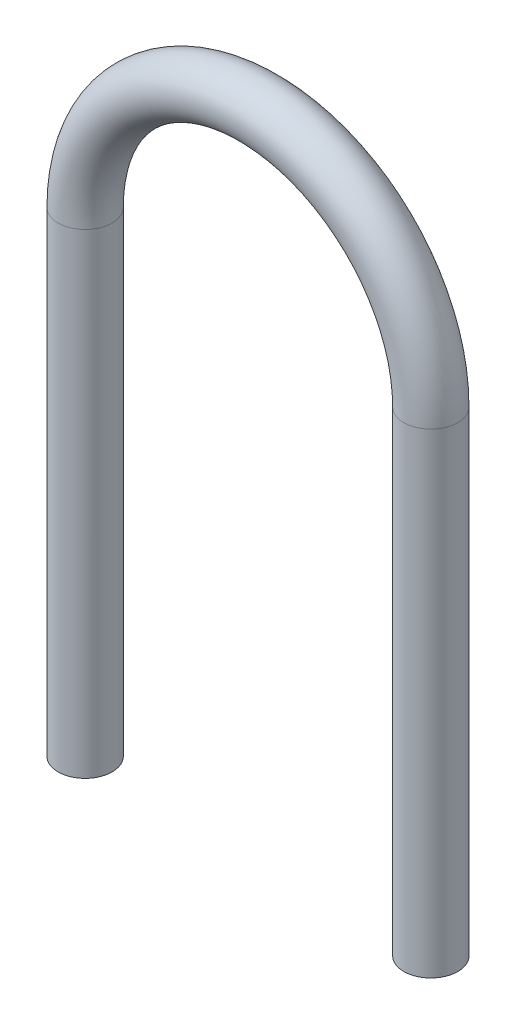
ISO-10303-21;
HEADER;
FILE_DESCRIPTION(('STEP AP214'),'2;1');
FILE_NAME('part.step','',(''),(''),'','','');
FILE_SCHEMA(('AUTOMOTIVE_DESIGN { 1 0 10303 214 1 1 1 1 }'));
ENDSEC;
DATA;
#1=APPLICATION_CONTEXT('core data for automotive mechanical design processes');
#2=APPLICATION_PROTOCOL_DEFINITION('international standard','automotive_design',2000,#1);
#3=PRODUCT_CONTEXT('',#1,'mechanical');
#4=PRODUCT('Part','Part','',(#3));
#5=PRODUCT_RELATED_PRODUCT_CATEGORY('part','',(#4));
#6=PRODUCT_DEFINITION_FORMATION('','',#4);
#7=PRODUCT_DEFINITION_CONTEXT('part definition',#1,'design');
#8=PRODUCT_DEFINITION('design','',#6,#7);
#9=PRODUCT_DEFINITION_SHAPE('','',#8);
#10=(LENGTH_UNIT() NAMED_UNIT(*) SI_UNIT(.MILLI.,.METRE.));
#11=(NAMED_UNIT(*) PLANE_ANGLE_UNIT() SI_UNIT($,.RADIAN.));
#12=(NAMED_UNIT(*) SI_UNIT($,.STERADIAN.) SOLID_ANGLE_UNIT());
#13=UNCERTAINTY_MEASURE_WITH_UNIT(LENGTH_MEASURE(1.E-05),#10,'distance_accuracy_value','');
#14=(GEOMETRIC_REPRESENTATION_CONTEXT(3) GLOBAL_UNCERTAINTY_ASSIGNED_CONTEXT((#13)) GLOBAL_UNIT_ASSIGNED_CONTEXT((#10,
#11,#12)) REPRESENTATION_CONTEXT('',''));
#15=CARTESIAN_POINT('',(0.,0.,0.));
#16=DIRECTION('',(0.,0.,1.));
#17=DIRECTION('',(1.,0.,0.));
#18=AXIS2_PLACEMENT_3D('',#15,#16,#17);
#19=CARTESIAN_POINT('',(-25.4,0.,0.));
#20=DIRECTION('',(0.,-1.,0.));
#21=DIRECTION('',(1.,0.,0.));
#22=AXIS2_PLACEMENT_3D('',#19,#20,#21);
#23=CYLINDRICAL_SURFACE('',#22,3.96875);
#24=CARTESIAN_POINT('',(-25.4,0.,0.));
#25=DIRECTION('',(0.,-1.,0.));
#26=DIRECTION('',(0.,0.,1.));
#27=AXIS2_PLACEMENT_3D('',#24,#25,#26);
#28=CIRCLE('',#27,3.96875);
#29=CARTESIAN_POINT('',(-29.36875,0.,0.));
#30=VERTEX_POINT('',#29);
#31=EDGE_CURVE('E35',#30,#30,#28,.T.);
#32=ORIENTED_EDGE('',*,*,#31,.T.);
#33=EDGE_LOOP('',(#32));
#34=FACE_BOUND('',#33,.T.);
#35=CARTESIAN_POINT('',(-25.4,-69.85,0.));
#36=DIRECTION('',(0.,-1.,0.));
#37=DIRECTION('',(0.,0.,1.));
#38=AXIS2_PLACEMENT_3D('',#35,#36,#37);
#39=CIRCLE('',#38,3.96875);
#40=CARTESIAN_POINT('',(-25.4,-69.85,3.96875));
#41=VERTEX_POINT('',#40);
#42=EDGE_CURVE('E10',#41,#41,#39,.T.);
#43=ORIENTED_EDGE('',*,*,#42,.F.);
#44=EDGE_LOOP('',(#43));
#45=FACE_BOUND('',#44,.T.);
#46=ADVANCED_FACE('F29',(#34,#45),#23,.T.);
#47=CARTESIAN_POINT('',(0.,0.,0.));
#48=DIRECTION('',(0.,0.,1.));
#49=DIRECTION('',(1.,0.,0.));
#50=AXIS2_PLACEMENT_3D('',#47,#48,#49);
#51=TOROIDAL_SURFACE('',#50,25.4,3.96875);
#52=CARTESIAN_POINT('',(25.4,0.,0.));
#53=DIRECTION('',(0.,1.,0.));
#54=DIRECTION('',(0.,0.,1.));
#55=AXIS2_PLACEMENT_3D('',#52,#53,#54);
#56=CIRCLE('',#55,3.96875);
#57=CARTESIAN_POINT('',(29.36875,0.,0.));
#58=VERTEX_POINT('',#57);
#59=EDGE_CURVE('E39',#58,#58,#56,.T.);
#60=CARTESIAN_POINT('',(0.,0.,0.));
#61=DIRECTION('',(0.,0.,1.));
#62=DIRECTION('',(1.,0.,0.));
#63=AXIS2_PLACEMENT_3D('',#60,#61,#62);
#64=CIRCLE('',#63,29.36875);
#65=EDGE_CURVE('',#58,#30,#64,.T.);
#66=ORIENTED_EDGE('',*,*,#59,.T.);
#67=ORIENTED_EDGE('',*,*,#31,.F.);
#68=ORIENTED_EDGE('',*,*,#65,.T.);
#69=ORIENTED_EDGE('',*,*,#65,.F.);
#70=EDGE_LOOP('',(#66,#68,#67,#69));
#71=FACE_BOUND('',#70,.T.);
#72=ADVANCED_FACE('F61',(#71),#51,.T.);
#73=CARTESIAN_POINT('',(25.4,0.,0.));
#74=DIRECTION('',(0.,-1.,0.));
#75=DIRECTION('',(1.,0.,0.));
#76=AXIS2_PLACEMENT_3D('',#73,#74,#75);
#77=CYLINDRICAL_SURFACE('',#76,3.96875);
#78=ORIENTED_EDGE('',*,*,#59,.F.);
#79=EDGE_LOOP('',(#78));
#80=FACE_BOUND('',#79,.T.);
#81=CARTESIAN_POINT('',(25.4,-69.85,0.));
#82=DIRECTION('',(0.,1.,0.));
#83=DIRECTION('',(0.,0.,1.));
#84=AXIS2_PLACEMENT_3D('',#81,#82,#83);
#85=CIRCLE('',#84,3.96875);
#86=CARTESIAN_POINT('',(25.4,-69.85,3.96875));
#87=VERTEX_POINT('',#86);
#88=EDGE_CURVE('E43',#87,#87,#85,.T.);
#89=ORIENTED_EDGE('',*,*,#88,.T.);
#90=EDGE_LOOP('',(#89));
#91=FACE_BOUND('',#90,.T.);
#92=ADVANCED_FACE('F49',(#80,#91),#77,.T.);
#93=CARTESIAN_POINT('',(-25.4,-69.85,0.));
#94=DIRECTION('',(0.,-1.,0.));
#95=DIRECTION('',(0.,0.,1.));
#96=AXIS2_PLACEMENT_3D('',#93,#94,#95);
#97=PLANE('',#96);
#98=ORIENTED_EDGE('',*,*,#42,.T.);
#99=EDGE_LOOP('',(#98));
#100=FACE_BOUND('',#99,.T.);
#101=ADVANCED_FACE('F53',(#100),#97,.T.);
#102=CARTESIAN_POINT('',(25.4,-69.85,0.));
#103=DIRECTION('',(0.,1.,0.));
#104=DIRECTION('',(0.,0.,1.));
#105=AXIS2_PLACEMENT_3D('',#102,#103,#104);
#106=PLANE('',#105);
#107=ORIENTED_EDGE('',*,*,#88,.F.);
#108=EDGE_LOOP('',(#107));
#109=FACE_BOUND('',#108,.T.);
#110=ADVANCED_FACE('F51',(#109),#106,.F.);
#111=CLOSED_SHELL('',(#46,#72,#92,#101,#110));
#112=MANIFOLD_SOLID_BREP('B2',#111);
#113=ADVANCED_BREP_SHAPE_REPRESENTATION('',(#18,#112),#14);
#114=SHAPE_DEFINITION_REPRESENTATION(#9,#113);
ENDSEC;
END-ISO-10303-21;
